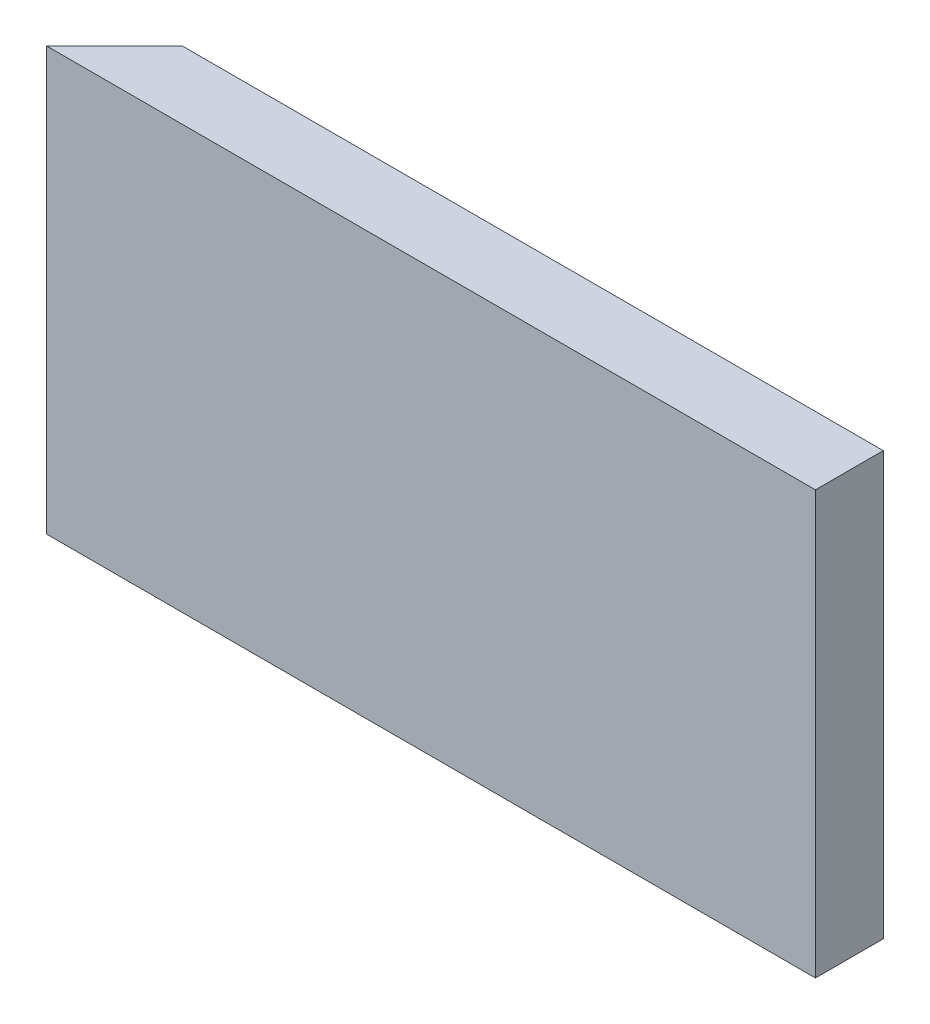
ISO-10303-21;
HEADER;
FILE_DESCRIPTION(('STEP AP214'),'2;1');
FILE_NAME('part.step','',(''),(''),'','','');
FILE_SCHEMA(('AUTOMOTIVE_DESIGN { 1 0 10303 214 1 1 1 1 }'));
ENDSEC;
DATA;
#1=APPLICATION_CONTEXT('core data for automotive mechanical design processes');
#2=APPLICATION_PROTOCOL_DEFINITION('international standard','automotive_design',2000,#1);
#3=PRODUCT_CONTEXT('',#1,'mechanical');
#4=PRODUCT('Part','Part','',(#3));
#5=PRODUCT_RELATED_PRODUCT_CATEGORY('part','',(#4));
#6=PRODUCT_DEFINITION_FORMATION('','',#4);
#7=PRODUCT_DEFINITION_CONTEXT('part definition',#1,'design');
#8=PRODUCT_DEFINITION('design','',#6,#7);
#9=PRODUCT_DEFINITION_SHAPE('','',#8);
#10=(LENGTH_UNIT() NAMED_UNIT(*) SI_UNIT(.MILLI.,.METRE.));
#11=(NAMED_UNIT(*) PLANE_ANGLE_UNIT() SI_UNIT($,.RADIAN.));
#12=(NAMED_UNIT(*) SI_UNIT($,.STERADIAN.) SOLID_ANGLE_UNIT());
#13=UNCERTAINTY_MEASURE_WITH_UNIT(LENGTH_MEASURE(1.E-05),#10,'distance_accuracy_value','');
#14=(GEOMETRIC_REPRESENTATION_CONTEXT(3) GLOBAL_UNCERTAINTY_ASSIGNED_CONTEXT((#13)) GLOBAL_UNIT_ASSIGNED_CONTEXT((#10,
#11,#12)) REPRESENTATION_CONTEXT('',''));
#15=CARTESIAN_POINT('',(0.,0.,0.));
#16=DIRECTION('',(0.,0.,1.));
#17=DIRECTION('',(1.,0.,0.));
#18=AXIS2_PLACEMENT_3D('',#15,#16,#17);
#19=CARTESIAN_POINT('',(215.9,0.,0.));
#20=DIRECTION('',(0.,1.,0.));
#21=DIRECTION('',(0.,0.,1.));
#22=AXIS2_PLACEMENT_3D('',#19,#20,#21);
#23=PLANE('',#22);
#24=DIRECTION('',(0.707106781186547,0.,-0.707106781186549));
#25=VECTOR('',#24,1.);
#26=CARTESIAN_POINT('',(0.,0.,0.));
#27=LINE('',#26,#25);
#28=CARTESIAN_POINT('',(0.,0.,0.));
#29=VERTEX_POINT('',#28);
#30=CARTESIAN_POINT('',(19.0499999999999,0.,-19.05));
#31=VERTEX_POINT('',#30);
#32=EDGE_CURVE('E72',#29,#31,#27,.T.);
#33=ORIENTED_EDGE('',*,*,#32,.T.);
#34=DIRECTION('',(-1.,0.,0.));
#35=VECTOR('',#34,1.);
#36=CARTESIAN_POINT('',(215.9,0.,-19.05));
#37=LINE('',#36,#35);
#38=CARTESIAN_POINT('',(215.9,0.,-19.05));
#39=VERTEX_POINT('',#38);
#40=EDGE_CURVE('E41',#39,#31,#37,.T.);
#41=ORIENTED_EDGE('',*,*,#40,.F.);
#42=DIRECTION('',(0.,0.,-1.));
#43=VECTOR('',#42,1.);
#44=CARTESIAN_POINT('',(215.9,0.,0.));
#45=LINE('',#44,#43);
#46=CARTESIAN_POINT('',(215.9,0.,0.));
#47=VERTEX_POINT('',#46);
#48=EDGE_CURVE('E99',#47,#39,#45,.T.);
#49=ORIENTED_EDGE('',*,*,#48,.F.);
#50=DIRECTION('',(-1.,0.,0.));
#51=VECTOR('',#50,1.);
#52=CARTESIAN_POINT('',(215.9,0.,0.));
#53=LINE('',#52,#51);
#54=EDGE_CURVE('E11',#47,#29,#53,.T.);
#55=ORIENTED_EDGE('',*,*,#54,.T.);
#56=EDGE_LOOP('',(#33,#41,#49,#55));
#57=FACE_BOUND('',#56,.T.);
#58=ADVANCED_FACE('F32',(#57),#23,.F.);
#59=CARTESIAN_POINT('',(215.9,0.,-19.05));
#60=DIRECTION('',(0.,0.,1.));
#61=DIRECTION('',(1.,0.,0.));
#62=AXIS2_PLACEMENT_3D('',#59,#60,#61);
#63=PLANE('',#62);
#64=DIRECTION('',(0.,-1.,0.));
#65=VECTOR('',#64,1.);
#66=CARTESIAN_POINT('',(19.0499999999999,215.9,-19.05));
#67=LINE('',#66,#65);
#68=CARTESIAN_POINT('',(19.0499999999999,118.745,-19.05));
#69=VERTEX_POINT('',#68);
#70=EDGE_CURVE('E69',#69,#31,#67,.T.);
#71=ORIENTED_EDGE('',*,*,#70,.F.);
#72=DIRECTION('',(-1.,0.,0.));
#73=VECTOR('',#72,1.);
#74=CARTESIAN_POINT('',(215.9,118.745,-19.05));
#75=LINE('',#74,#73);
#76=CARTESIAN_POINT('',(215.9,118.745,-19.05));
#77=VERTEX_POINT('',#76);
#78=EDGE_CURVE('E88',#77,#69,#75,.T.);
#79=ORIENTED_EDGE('',*,*,#78,.F.);
#80=DIRECTION('',(0.,1.,0.));
#81=VECTOR('',#80,1.);
#82=CARTESIAN_POINT('',(215.9,0.,-19.05));
#83=LINE('',#82,#81);
#84=EDGE_CURVE('E87',#39,#77,#83,.T.);
#85=ORIENTED_EDGE('',*,*,#84,.F.);
#86=ORIENTED_EDGE('',*,*,#40,.T.);
#87=EDGE_LOOP('',(#71,#79,#85,#86));
#88=FACE_BOUND('',#87,.T.);
#89=ADVANCED_FACE('F86',(#88),#63,.F.);
#90=CARTESIAN_POINT('',(215.9,118.745,0.));
#91=DIRECTION('',(0.,-1.,0.));
#92=DIRECTION('',(0.,0.,-1.));
#93=AXIS2_PLACEMENT_3D('',#90,#91,#92);
#94=PLANE('',#93);
#95=DIRECTION('',(0.707106781186547,0.,-0.707106781186549));
#96=VECTOR('',#95,1.);
#97=CARTESIAN_POINT('',(107.95,118.745,-107.95));
#98=LINE('',#97,#96);
#99=CARTESIAN_POINT('',(0.,118.745,0.));
#100=VERTEX_POINT('',#99);
#101=EDGE_CURVE('E74',#100,#69,#98,.T.);
#102=ORIENTED_EDGE('',*,*,#101,.F.);
#103=DIRECTION('',(-1.,0.,0.));
#104=VECTOR('',#103,1.);
#105=CARTESIAN_POINT('',(215.9,118.745,0.));
#106=LINE('',#105,#104);
#107=CARTESIAN_POINT('',(215.9,118.745,0.));
#108=VERTEX_POINT('',#107);
#109=EDGE_CURVE('E89',#108,#100,#106,.T.);
#110=ORIENTED_EDGE('',*,*,#109,.F.);
#111=DIRECTION('',(0.,0.,1.));
#112=VECTOR('',#111,1.);
#113=CARTESIAN_POINT('',(215.9,118.745,0.));
#114=LINE('',#113,#112);
#115=EDGE_CURVE('E48',#77,#108,#114,.T.);
#116=ORIENTED_EDGE('',*,*,#115,.F.);
#117=ORIENTED_EDGE('',*,*,#78,.T.);
#118=EDGE_LOOP('',(#102,#110,#116,#117));
#119=FACE_BOUND('',#118,.T.);
#120=ADVANCED_FACE('F106',(#119),#94,.F.);
#121=CARTESIAN_POINT('',(215.9,0.,0.));
#122=DIRECTION('',(0.,0.,-1.));
#123=DIRECTION('',(-1.,0.,0.));
#124=AXIS2_PLACEMENT_3D('',#121,#122,#123);
#125=PLANE('',#124);
#126=DIRECTION('',(0.,-1.,0.));
#127=VECTOR('',#126,1.);
#128=CARTESIAN_POINT('',(0.,0.,0.));
#129=LINE('',#128,#127);
#130=EDGE_CURVE('E94',#100,#29,#129,.T.);
#131=ORIENTED_EDGE('',*,*,#130,.T.);
#132=ORIENTED_EDGE('',*,*,#54,.F.);
#133=DIRECTION('',(0.,-1.,0.));
#134=VECTOR('',#133,1.);
#135=CARTESIAN_POINT('',(215.9,0.,0.));
#136=LINE('',#135,#134);
#137=EDGE_CURVE('E96',#108,#47,#136,.T.);
#138=ORIENTED_EDGE('',*,*,#137,.F.);
#139=ORIENTED_EDGE('',*,*,#109,.T.);
#140=EDGE_LOOP('',(#131,#132,#138,#139));
#141=FACE_BOUND('',#140,.T.);
#142=ADVANCED_FACE('F34',(#141),#125,.F.);
#143=CARTESIAN_POINT('',(215.9,0.,0.));
#144=DIRECTION('',(-1.,0.,0.));
#145=DIRECTION('',(0.,0.,1.));
#146=AXIS2_PLACEMENT_3D('',#143,#144,#145);
#147=PLANE('',#146);
#148=ORIENTED_EDGE('',*,*,#137,.T.);
#149=ORIENTED_EDGE('',*,*,#48,.T.);
#150=ORIENTED_EDGE('',*,*,#84,.T.);
#151=ORIENTED_EDGE('',*,*,#115,.T.);
#152=EDGE_LOOP('',(#148,#149,#150,#151));
#153=FACE_BOUND('',#152,.T.);
#154=ADVANCED_FACE('F103',(#153),#147,.F.);
#155=CARTESIAN_POINT('',(0.,215.9,0.));
#156=DIRECTION('',(-0.707106781186549,0.,-0.707106781186547));
#157=DIRECTION('',(-0.707106781186547,0.,0.707106781186549));
#158=AXIS2_PLACEMENT_3D('',#155,#156,#157);
#159=PLANE('',#158);
#160=ORIENTED_EDGE('',*,*,#101,.T.);
#161=ORIENTED_EDGE('',*,*,#70,.T.);
#162=ORIENTED_EDGE('',*,*,#32,.F.);
#163=ORIENTED_EDGE('',*,*,#130,.F.);
#164=EDGE_LOOP('',(#160,#161,#162,#163));
#165=FACE_BOUND('',#164,.T.);
#166=ADVANCED_FACE('F71',(#165),#159,.T.);
#167=CLOSED_SHELL('',(#58,#89,#120,#142,#154,#166));
#168=MANIFOLD_SOLID_BREP('B2',#167);
#169=ADVANCED_BREP_SHAPE_REPRESENTATION('',(#18,#168),#14);
#170=SHAPE_DEFINITION_REPRESENTATION(#9,#169);
ENDSEC;
END-ISO-10303-21;
